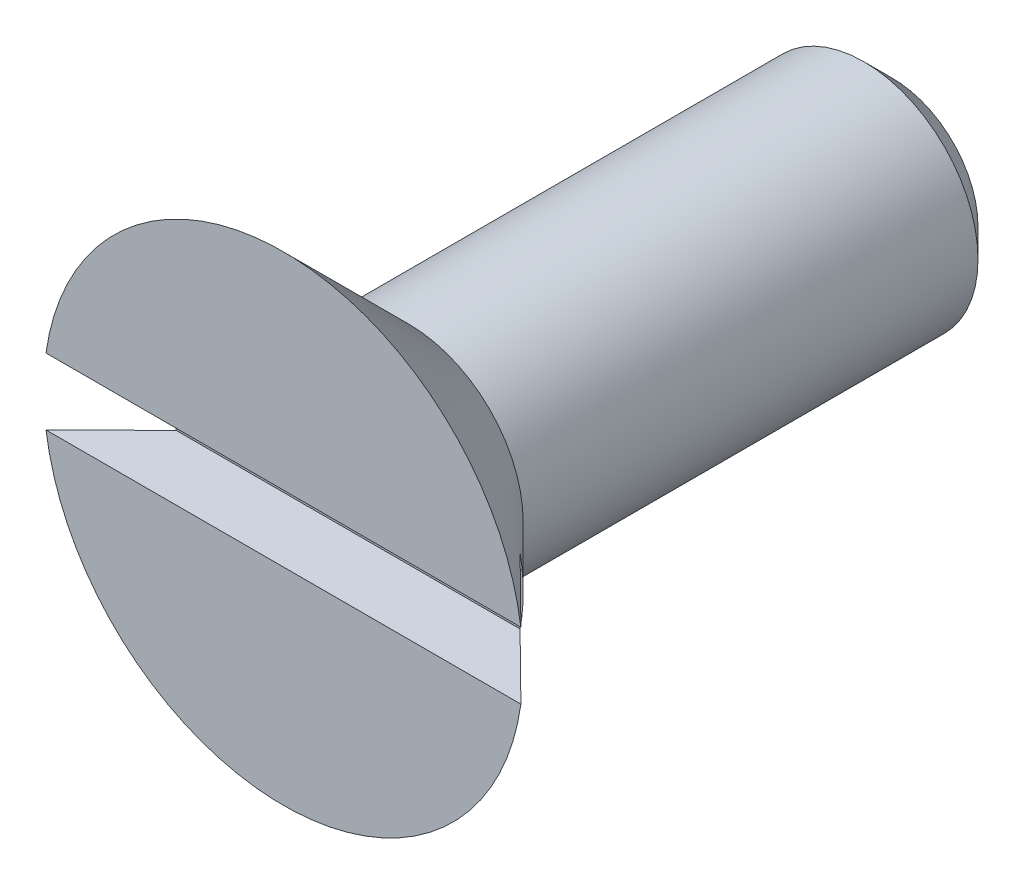
ISO-10303-21;
HEADER;
FILE_DESCRIPTION(('STEP AP214'),'2;1');
FILE_NAME('part.step','',(''),(''),'','','');
FILE_SCHEMA(('AUTOMOTIVE_DESIGN { 1 0 10303 214 1 1 1 1 }'));
ENDSEC;
DATA;
#1=APPLICATION_CONTEXT('core data for automotive mechanical design processes');
#2=APPLICATION_PROTOCOL_DEFINITION('international standard','automotive_design',2000,#1);
#3=PRODUCT_CONTEXT('',#1,'mechanical');
#4=PRODUCT('Part','Part','',(#3));
#5=PRODUCT_RELATED_PRODUCT_CATEGORY('part','',(#4));
#6=PRODUCT_DEFINITION_FORMATION('','',#4);
#7=PRODUCT_DEFINITION_CONTEXT('part definition',#1,'design');
#8=PRODUCT_DEFINITION('design','',#6,#7);
#9=PRODUCT_DEFINITION_SHAPE('','',#8);
#10=(LENGTH_UNIT() NAMED_UNIT(*) SI_UNIT(.MILLI.,.METRE.));
#11=(NAMED_UNIT(*) PLANE_ANGLE_UNIT() SI_UNIT($,.RADIAN.));
#12=(NAMED_UNIT(*) SI_UNIT($,.STERADIAN.) SOLID_ANGLE_UNIT());
#13=UNCERTAINTY_MEASURE_WITH_UNIT(LENGTH_MEASURE(1.E-05),#10,'distance_accuracy_value','');
#14=(GEOMETRIC_REPRESENTATION_CONTEXT(3) GLOBAL_UNCERTAINTY_ASSIGNED_CONTEXT((#13)) GLOBAL_UNIT_ASSIGNED_CONTEXT((#10,
#11,#12)) REPRESENTATION_CONTEXT('',''));
#15=CARTESIAN_POINT('',(0.,0.,0.));
#16=DIRECTION('',(0.,0.,1.));
#17=DIRECTION('',(1.,0.,0.));
#18=AXIS2_PLACEMENT_3D('',#15,#16,#17);
#19=CARTESIAN_POINT('',(0.,0.,1.7));
#20=DIRECTION('',(0.,0.,-1.));
#21=DIRECTION('',(-1.,0.,0.));
#22=AXIS2_PLACEMENT_3D('',#19,#20,#21);
#23=PLANE('',#22);
#24=CARTESIAN_POINT('',(0.,0.,1.7));
#25=DIRECTION('',(0.,0.,1.));
#26=DIRECTION('',(1.,0.,0.));
#27=AXIS2_PLACEMENT_3D('',#24,#25,#26);
#28=CIRCLE('',#27,3.15);
#29=CARTESIAN_POINT('',(-3.11947010724578,-0.4375,1.7));
#30=VERTEX_POINT('',#29);
#31=CARTESIAN_POINT('',(3.11947010724578,-0.4375,1.7));
#32=VERTEX_POINT('',#31);
#33=EDGE_CURVE('E104',#30,#32,#28,.T.);
#34=ORIENTED_EDGE('',*,*,#33,.T.);
#35=DIRECTION('',(1.,0.,0.));
#36=VECTOR('',#35,1.);
#37=CARTESIAN_POINT('',(-3.15,-0.4375,1.7));
#38=LINE('',#37,#36);
#39=EDGE_CURVE('E98',#30,#32,#38,.T.);
#40=ORIENTED_EDGE('',*,*,#39,.F.);
#41=EDGE_LOOP('',(#34,#40));
#42=FACE_BOUND('',#41,.T.);
#43=ADVANCED_FACE('F41',(#42),#23,.F.);
#44=CARTESIAN_POINT('',(3.11947010724578,0.4375,1.7));
#45=VERTEX_POINT('',#44);
#46=CARTESIAN_POINT('',(-3.11947010724578,0.4375,1.7));
#47=VERTEX_POINT('',#46);
#48=EDGE_CURVE('E97',#45,#47,#28,.T.);
#49=ORIENTED_EDGE('',*,*,#48,.T.);
#50=DIRECTION('',(-1.,0.,0.));
#51=VECTOR('',#50,1.);
#52=CARTESIAN_POINT('',(-3.15,0.4375,1.7));
#53=LINE('',#52,#51);
#54=EDGE_CURVE('E89',#45,#47,#53,.T.);
#55=ORIENTED_EDGE('',*,*,#54,.F.);
#56=EDGE_LOOP('',(#49,#55));
#57=FACE_BOUND('',#56,.T.);
#58=ADVANCED_FACE('F43',(#57),#23,.F.);
#59=CARTESIAN_POINT('',(0.,0.,0.0500000000000079));
#60=DIRECTION('',(0.,0.,1.));
#61=DIRECTION('',(1.,0.,0.));
#62=AXIS2_PLACEMENT_3D('',#59,#60,#61);
#63=CONICAL_SURFACE('',#62,1.5,0.785398163397451);
#64=ORIENTED_EDGE('',*,*,#33,.F.);
#65=CARTESIAN_POINT('',(-6.95069435097477,-0.4375,5.51444959854491));
#66=CARTESIAN_POINT('',(-6.71545377725601,-0.4375,5.27967721431496));
#67=CARTESIAN_POINT('',(-6.48019303350266,-0.4375,5.04492502441663));
#68=CARTESIAN_POINT('',(-6.00960192345305,-0.4375,4.57548243964187));
#69=CARTESIAN_POINT('',(-5.77427155604116,-0.4375,4.34079204588382));
#70=CARTESIAN_POINT('',(-5.30343158176121,-0.4375,3.87141438717137));
#71=CARTESIAN_POINT('',(-5.06792194077094,-0.4375,3.63672715644325));
#72=CARTESIAN_POINT('',(-4.59677017117157,-0.4375,3.16749350357989));
#73=CARTESIAN_POINT('',(-4.3611280448257,-0.4375,2.93294707917283));
#74=CARTESIAN_POINT('',(-3.87890631331682,-0.4375,2.45341460844365));
#75=CARTESIAN_POINT('',(-3.63231655090313,-0.4375,2.20843877608446));
#76=CARTESIAN_POINT('',(-3.13871112808016,-0.4375,1.71889165526523));
#77=CARTESIAN_POINT('',(-2.89169544725845,-0.4375,1.47432038736061));
#78=CARTESIAN_POINT('',(-2.52054668169718,-0.4375,1.10815678841121));
#79=CARTESIAN_POINT('',(-2.3967412827444,-0.4375,0.986232561251597));
#80=CARTESIAN_POINT('',(-2.14877789483762,-0.4375,0.74273812276414));
#81=CARTESIAN_POINT('',(-2.02461989882203,-0.4375,0.621167918626616));
#82=CARTESIAN_POINT('',(-1.77574261990939,-0.4375,0.378624419174153));
#83=CARTESIAN_POINT('',(-1.65102338979819,-0.4375,0.257651069877583));
#84=CARTESIAN_POINT('',(-1.46312840439675,-0.4375,0.0770435419685614));
#85=CARTESIAN_POINT('',(-1.40036175145822,-0.4375,0.0169840897073071));
#86=CARTESIAN_POINT('',(-1.27442762204848,-0.4375,-0.10271274659936));
#87=CARTESIAN_POINT('',(-1.21126015041921,-0.4375,-0.162350135725008));
#88=CARTESIAN_POINT('',(-1.11382173052775,-0.4375,-0.25339613639642));
#89=CARTESIAN_POINT('',(-1.07976946155462,-0.4375,-0.285038611518478));
#90=CARTESIAN_POINT('',(-1.01143604619376,-0.4375,-0.348076858100941));
#91=CARTESIAN_POINT('',(-0.977154895825766,-0.4375,-0.3794726252503));
#92=CARTESIAN_POINT('',(-0.908445877673763,-0.4375,-0.441798127970912));
#93=CARTESIAN_POINT('',(-0.874019325470927,-0.4375,-0.472729308933459));
#94=CARTESIAN_POINT('',(-0.804767226320551,-0.4375,-0.534138554654185));
#95=CARTESIAN_POINT('',(-0.7699416938768,-0.4375,-0.564616635791555));
#96=CARTESIAN_POINT('',(-0.687524321535922,-0.4375,-0.635446109424893));
#97=CARTESIAN_POINT('',(-0.63970868674946,-0.4375,-0.675541043817061));
#98=CARTESIAN_POINT('',(-0.566556991446948,-0.4375,-0.73432913801779));
#99=CARTESIAN_POINT('',(-0.54182952959947,-0.4375,-0.753777222319424));
#100=CARTESIAN_POINT('',(-0.491822543056473,-0.4375,-0.791947470581388));
#101=CARTESIAN_POINT('',(-0.466543099302396,-0.4375,-0.810669739870932));
#102=CARTESIAN_POINT('',(-0.414775435391958,-0.4375,-0.847417533943371));
#103=CARTESIAN_POINT('',(-0.388273549584466,-0.4375,-0.865423985183118));
#104=CARTESIAN_POINT('',(-0.334192522338339,-0.4375,-0.899859213763832));
#105=CARTESIAN_POINT('',(-0.306611926297403,-0.4375,-0.916285749684858));
#106=CARTESIAN_POINT('',(-0.250452865815358,-0.4375,-0.946436009532494));
#107=CARTESIAN_POINT('',(-0.221892495276722,-0.4375,-0.960192701204188));
#108=CARTESIAN_POINT('',(-0.163218417249906,-0.4375,-0.983807638318881));
#109=CARTESIAN_POINT('',(-0.133110728635988,-0.4375,-0.993679862316532));
#110=CARTESIAN_POINT('',(-0.0880223692180264,-0.4375,-1.00395141312084));
#111=CARTESIAN_POINT('',(-0.073551465305175,-0.4375,-1.00659400426285));
#112=CARTESIAN_POINT('',(-0.0444235926394925,-0.4375,-1.01048860754213));
#113=CARTESIAN_POINT('',(-0.0297666321560671,-0.4375,-1.0117406812645));
#114=CARTESIAN_POINT('',(0.0142250952761395,-0.4375,-1.01323688027924));
#115=CARTESIAN_POINT('',(0.0436649939441677,-0.4375,-1.01124128469903));
#116=CARTESIAN_POINT('',(0.101292142840405,-0.4375,-1.0018327116412));
#117=CARTESIAN_POINT('',(0.129488837077696,-0.4375,-0.994472979526124));
#118=CARTESIAN_POINT('',(0.170809309856394,-0.4375,-0.980519211556384));
#119=CARTESIAN_POINT('',(0.184454897966584,-0.4375,-0.975364865735926));
#120=CARTESIAN_POINT('',(0.211412528671322,-0.4375,-0.96425186784909));
#121=CARTESIAN_POINT('',(0.224724643745628,-0.4375,-0.958293392389047));
#122=CARTESIAN_POINT('',(0.266777045448894,-0.4375,-0.938210779497741));
#123=CARTESIAN_POINT('',(0.294921432003761,-0.4375,-0.922845882651961));
#124=CARTESIAN_POINT('',(0.350046604409141,-0.4375,-0.89013582475984));
#125=CARTESIAN_POINT('',(0.377025762743036,-0.4375,-0.87278800997322));
#126=CARTESIAN_POINT('',(0.430201279890642,-0.4375,-0.83673288612168));
#127=CARTESIAN_POINT('',(0.456394298082687,-0.4375,-0.818020690833663));
#128=CARTESIAN_POINT('',(0.50812313076528,-0.4375,-0.77970481009805));
#129=CARTESIAN_POINT('',(0.533658785434775,-0.4375,-0.760100911001922));
#130=CARTESIAN_POINT('',(0.610057648748741,-0.4375,-0.699952314625999));
#131=CARTESIAN_POINT('',(0.660169188221462,-0.4375,-0.658457053720058));
#132=CARTESIAN_POINT('',(0.759095952529052,-0.4375,-0.574228201210139));
#133=CARTESIAN_POINT('',(0.807914210937513,-0.4375,-0.531498112455194));
#134=CARTESIAN_POINT('',(0.903777928724115,-0.4375,-0.4461297183887));
#135=CARTESIAN_POINT('',(0.950838989272428,-0.4375,-0.403508906492821));
#136=CARTESIAN_POINT('',(1.04448251759101,-0.4375,-0.317745372768809));
#137=CARTESIAN_POINT('',(1.09106497765321,-0.4375,-0.274602642559246));
#138=CARTESIAN_POINT('',(1.23032604080343,-0.4375,-0.144633863624959));
#139=CARTESIAN_POINT('',(1.32250810126808,-0.4375,-0.05727648186134));
#140=CARTESIAN_POINT('',(1.50626750098789,-0.4375,0.118289223323196));
#141=CARTESIAN_POINT('',(1.59784397500925,-0.4375,0.206498447368561));
#142=CARTESIAN_POINT('',(1.78054968777642,-0.4375,0.383368131795782));
#143=CARTESIAN_POINT('',(1.8716789522241,-0.4375,0.47202856563489));
#144=CARTESIAN_POINT('',(2.0527126028453,-0.4375,0.648726833335544));
#145=CARTESIAN_POINT('',(2.14261992922196,-0.4375,0.73676165898462));
#146=CARTESIAN_POINT('',(2.32224140147481,-0.4375,0.913030831048659));
#147=CARTESIAN_POINT('',(2.41195554439885,-0.4375,1.00126518047099));
#148=CARTESIAN_POINT('',(2.68081262073546,-0.4375,1.26610037012193));
#149=CARTESIAN_POINT('',(2.85974916511933,-0.4375,1.44291065018944));
#150=CARTESIAN_POINT('',(3.36306970387667,-0.4375,1.94108895648711));
#151=CARTESIAN_POINT('',(3.68711145552849,-0.4375,2.26280243883242));
#152=CARTESIAN_POINT('',(4.33482479338633,-0.4375,2.90671341989869));
#153=CARTESIAN_POINT('',(4.65849630580628,-0.4375,3.22891099276393));
#154=CARTESIAN_POINT('',(5.31036659154146,-0.4375,3.87827901327936));
#155=CARTESIAN_POINT('',(5.63856193497032,-0.4375,4.20545290383715));
#156=CARTESIAN_POINT('',(6.29474601208318,-0.4375,4.85989136733905));
#157=CARTESIAN_POINT('',(6.6227347721014,-0.4375,5.18715591387629));
#158=CARTESIAN_POINT('',(6.95069435097477,-0.4375,5.51444959854491));
#159=B_SPLINE_CURVE_WITH_KNOTS('',3,(#65,#66,#67,#68,#69,#70,#71,#72,#73,#74,#75,#76,#77,#78,
#79,#80,#81,#82,#83,#84,#85,#86,#87,#88,#89,#90,#91,#92,#93,#94,#95,#96,#97,#98,#99,#100,#101,
#102,#103,#104,#105,#106,#107,#108,#109,#110,#111,#112,#113,#114,#115,#116,#117,#118,#119,#120,
#121,#122,#123,#124,#125,#126,#127,#128,#129,#130,#131,#132,#133,#134,#135,#136,#137,#138,#139,
#140,#141,#142,#143,#144,#145,#146,#147,#148,#149,#150,#151,#152,#153,#154,#155,#156,#157,#158),
.UNSPECIFIED.,.F.,.F.,(4,2,2,2,2,2,2,2,2,2,2,2,2,2,2,2,2,2,2,2,2,2,2,2,2,2,2,2,2,2,2,2,2,2,2,2,
2,2,2,2,2,2,2,2,2,2,4),(0.,0.997048560654659,1.99411407159498,2.9915537582241,3.98897689423789,
5.03175047299187,6.07457549937006,6.59586149567601,7.11715800663534,7.63840647212515,
7.89902218841885,8.15963476241322,8.29908714979861,8.43854196861998,8.5773812160964,
8.71621543238273,8.90338051507032,8.99774881127713,9.09210336123648,9.18818823101548,
9.28440746521176,9.37935012372772,9.473947928805,9.5180182515728,9.56208662241713,
9.64996810467844,9.73698893848584,9.78072959357587,9.82446065774542,9.92051040347212,
10.0166902318302,10.1132332446856,10.2097995119603,10.4049299988875,10.5995527867628,
10.7900231132878,10.9804965026262,11.3614846523295,11.74293313361,12.1243594294601,
12.5018522839031,12.8793508666369,13.634016533687,15.0038781067776,16.3739768056718,
17.7642265085964,19.1542294238138),.UNSPECIFIED.);
#160=CARTESIAN_POINT('',(-2.25800658767861,-0.4375,0.85));
#161=VERTEX_POINT('',#160);
#162=EDGE_CURVE('E11',#30,#161,#159,.T.);
#163=ORIENTED_EDGE('',*,*,#162,.T.);
#164=CARTESIAN_POINT('',(0.,0.,0.85));
#165=DIRECTION('',(0.,0.,1.));
#166=DIRECTION('',(1.,0.,0.));
#167=AXIS2_PLACEMENT_3D('',#164,#165,#166);
#168=CIRCLE('',#167,2.3);
#169=CARTESIAN_POINT('',(-2.25800658767861,0.4375,0.85));
#170=VERTEX_POINT('',#169);
#171=EDGE_CURVE('E107',#170,#161,#168,.T.);
#172=ORIENTED_EDGE('',*,*,#171,.F.);
#173=CARTESIAN_POINT('',(6.95069435097477,0.4375,5.51444959854491));
#174=CARTESIAN_POINT('',(6.71545377725601,0.4375,5.27967721431496));
#175=CARTESIAN_POINT('',(6.48019303350266,0.4375,5.04492502441663));
#176=CARTESIAN_POINT('',(6.00960192345305,0.4375,4.57548243964187));
#177=CARTESIAN_POINT('',(5.77427155604116,0.4375,4.34079204588382));
#178=CARTESIAN_POINT('',(5.30343158176121,0.4375,3.87141438717137));
#179=CARTESIAN_POINT('',(5.06792194077094,0.4375,3.63672715644325));
#180=CARTESIAN_POINT('',(4.59677017117157,0.4375,3.16749350357989));
#181=CARTESIAN_POINT('',(4.3611280448257,0.4375,2.93294707917283));
#182=CARTESIAN_POINT('',(3.87890631331682,0.4375,2.45341460844365));
#183=CARTESIAN_POINT('',(3.63231655090313,0.4375,2.20843877608446));
#184=CARTESIAN_POINT('',(3.13871112808016,0.4375,1.71889165526523));
#185=CARTESIAN_POINT('',(2.89169544725845,0.4375,1.47432038736061));
#186=CARTESIAN_POINT('',(2.52054668169718,0.4375,1.10815678841121));
#187=CARTESIAN_POINT('',(2.3967412827444,0.4375,0.986232561251597));
#188=CARTESIAN_POINT('',(2.14877789483762,0.4375,0.74273812276414));
#189=CARTESIAN_POINT('',(2.02461989882203,0.4375,0.621167918626616));
#190=CARTESIAN_POINT('',(1.77574261990939,0.4375,0.378624419174153));
#191=CARTESIAN_POINT('',(1.65102338979819,0.4375,0.257651069877583));
#192=CARTESIAN_POINT('',(1.46312840439675,0.4375,0.0770435419685614));
#193=CARTESIAN_POINT('',(1.40036175145822,0.4375,0.0169840897073071));
#194=CARTESIAN_POINT('',(1.27442762204848,0.4375,-0.10271274659936));
#195=CARTESIAN_POINT('',(1.21126015041921,0.4375,-0.162350135725008));
#196=CARTESIAN_POINT('',(1.11382173052775,0.4375,-0.25339613639642));
#197=CARTESIAN_POINT('',(1.07976946155462,0.4375,-0.285038611518478));
#198=CARTESIAN_POINT('',(1.01143604619376,0.4375,-0.348076858100941));
#199=CARTESIAN_POINT('',(0.977154895825766,0.4375,-0.3794726252503));
#200=CARTESIAN_POINT('',(0.908445877673763,0.4375,-0.441798127970912));
#201=CARTESIAN_POINT('',(0.874019325470927,0.4375,-0.472729308933459));
#202=CARTESIAN_POINT('',(0.804767226320551,0.4375,-0.534138554654185));
#203=CARTESIAN_POINT('',(0.7699416938768,0.4375,-0.564616635791555));
#204=CARTESIAN_POINT('',(0.687524321535922,0.4375,-0.635446109424893));
#205=CARTESIAN_POINT('',(0.63970868674946,0.4375,-0.675541043817061));
#206=CARTESIAN_POINT('',(0.566556991446948,0.4375,-0.73432913801779));
#207=CARTESIAN_POINT('',(0.54182952959947,0.4375,-0.753777222319424));
#208=CARTESIAN_POINT('',(0.491822543056473,0.4375,-0.791947470581388));
#209=CARTESIAN_POINT('',(0.466543099302396,0.4375,-0.810669739870932));
#210=CARTESIAN_POINT('',(0.414775435391958,0.4375,-0.847417533943371));
#211=CARTESIAN_POINT('',(0.388273549584466,0.4375,-0.865423985183118));
#212=CARTESIAN_POINT('',(0.334192522338339,0.4375,-0.899859213763832));
#213=CARTESIAN_POINT('',(0.306611926297403,0.4375,-0.916285749684858));
#214=CARTESIAN_POINT('',(0.250452865815358,0.4375,-0.946436009532494));
#215=CARTESIAN_POINT('',(0.221892495276722,0.4375,-0.960192701204188));
#216=CARTESIAN_POINT('',(0.163218417249906,0.4375,-0.983807638318881));
#217=CARTESIAN_POINT('',(0.133110728635988,0.4375,-0.993679862316532));
#218=CARTESIAN_POINT('',(0.0880223692180264,0.4375,-1.00395141312084));
#219=CARTESIAN_POINT('',(0.073551465305175,0.4375,-1.00659400426285));
#220=CARTESIAN_POINT('',(0.0444235926394925,0.4375,-1.01048860754213));
#221=CARTESIAN_POINT('',(0.0297666321560671,0.4375,-1.0117406812645));
#222=CARTESIAN_POINT('',(-0.0142250952761395,0.4375,-1.01323688027924));
#223=CARTESIAN_POINT('',(-0.0436649939441677,0.4375,-1.01124128469903));
#224=CARTESIAN_POINT('',(-0.101292142840405,0.4375,-1.0018327116412));
#225=CARTESIAN_POINT('',(-0.129488837077696,0.4375,-0.994472979526124));
#226=CARTESIAN_POINT('',(-0.170809309856394,0.4375,-0.980519211556384));
#227=CARTESIAN_POINT('',(-0.184454897966584,0.4375,-0.975364865735926));
#228=CARTESIAN_POINT('',(-0.211412528671322,0.4375,-0.96425186784909));
#229=CARTESIAN_POINT('',(-0.224724643745628,0.4375,-0.958293392389047));
#230=CARTESIAN_POINT('',(-0.266777045448894,0.4375,-0.938210779497741));
#231=CARTESIAN_POINT('',(-0.294921432003761,0.4375,-0.922845882651961));
#232=CARTESIAN_POINT('',(-0.350046604409141,0.4375,-0.89013582475984));
#233=CARTESIAN_POINT('',(-0.377025762743036,0.4375,-0.87278800997322));
#234=CARTESIAN_POINT('',(-0.430201279890642,0.4375,-0.83673288612168));
#235=CARTESIAN_POINT('',(-0.456394298082687,0.4375,-0.818020690833663));
#236=CARTESIAN_POINT('',(-0.50812313076528,0.4375,-0.77970481009805));
#237=CARTESIAN_POINT('',(-0.533658785434775,0.4375,-0.760100911001922));
#238=CARTESIAN_POINT('',(-0.610057648748741,0.4375,-0.699952314625999));
#239=CARTESIAN_POINT('',(-0.660169188221462,0.4375,-0.658457053720058));
#240=CARTESIAN_POINT('',(-0.759095952529052,0.4375,-0.574228201210139));
#241=CARTESIAN_POINT('',(-0.807914210937513,0.4375,-0.531498112455194));
#242=CARTESIAN_POINT('',(-0.903777928724115,0.4375,-0.4461297183887));
#243=CARTESIAN_POINT('',(-0.950838989272428,0.4375,-0.403508906492821));
#244=CARTESIAN_POINT('',(-1.04448251759101,0.4375,-0.317745372768809));
#245=CARTESIAN_POINT('',(-1.09106497765321,0.4375,-0.274602642559246));
#246=CARTESIAN_POINT('',(-1.23032604080343,0.4375,-0.144633863624959));
#247=CARTESIAN_POINT('',(-1.32250810126808,0.4375,-0.05727648186134));
#248=CARTESIAN_POINT('',(-1.50626750098789,0.4375,0.118289223323196));
#249=CARTESIAN_POINT('',(-1.59784397500925,0.4375,0.206498447368561));
#250=CARTESIAN_POINT('',(-1.78054968777642,0.4375,0.383368131795782));
#251=CARTESIAN_POINT('',(-1.8716789522241,0.4375,0.47202856563489));
#252=CARTESIAN_POINT('',(-2.0527126028453,0.4375,0.648726833335544));
#253=CARTESIAN_POINT('',(-2.14261992922196,0.4375,0.73676165898462));
#254=CARTESIAN_POINT('',(-2.32224140147481,0.4375,0.913030831048659));
#255=CARTESIAN_POINT('',(-2.41195554439885,0.4375,1.00126518047099));
#256=CARTESIAN_POINT('',(-2.68081262073546,0.4375,1.26610037012193));
#257=CARTESIAN_POINT('',(-2.85974916511933,0.4375,1.44291065018944));
#258=CARTESIAN_POINT('',(-3.36306970387667,0.4375,1.94108895648711));
#259=CARTESIAN_POINT('',(-3.68711145552849,0.4375,2.26280243883242));
#260=CARTESIAN_POINT('',(-4.33482479338633,0.4375,2.90671341989869));
#261=CARTESIAN_POINT('',(-4.65849630580628,0.4375,3.22891099276393));
#262=CARTESIAN_POINT('',(-5.31036659154146,0.4375,3.87827901327936));
#263=CARTESIAN_POINT('',(-5.63856193497032,0.4375,4.20545290383715));
#264=CARTESIAN_POINT('',(-6.29474601208318,0.4375,4.85989136733905));
#265=CARTESIAN_POINT('',(-6.6227347721014,0.4375,5.18715591387629));
#266=CARTESIAN_POINT('',(-6.95069435097477,0.4375,5.51444959854491));
#267=B_SPLINE_CURVE_WITH_KNOTS('',3,(#173,#174,#175,#176,#177,#178,#179,#180,#181,#182,#183,
#184,#185,#186,#187,#188,#189,#190,#191,#192,#193,#194,#195,#196,#197,#198,#199,#200,#201,#202,
#203,#204,#205,#206,#207,#208,#209,#210,#211,#212,#213,#214,#215,#216,#217,#218,#219,#220,#221,
#222,#223,#224,#225,#226,#227,#228,#229,#230,#231,#232,#233,#234,#235,#236,#237,#238,#239,#240,
#241,#242,#243,#244,#245,#246,#247,#248,#249,#250,#251,#252,#253,#254,#255,#256,#257,#258,#259,
#260,#261,#262,#263,#264,#265,#266),.UNSPECIFIED.,.F.,.F.,(4,2,2,2,2,2,2,2,2,2,2,2,2,2,2,2,2,2,
2,2,2,2,2,2,2,2,2,2,2,2,2,2,2,2,2,2,2,2,2,2,2,2,2,2,2,2,4),(0.,0.997048560654659,
1.99411407159498,2.9915537582241,3.98897689423789,5.03175047299187,6.07457549937006,
6.59586149567601,7.11715800663534,7.63840647212515,7.89902218841885,8.15963476241322,
8.29908714979861,8.43854196861998,8.5773812160964,8.71621543238273,8.90338051507032,
8.99774881127713,9.09210336123648,9.18818823101548,9.28440746521176,9.37935012372772,
9.473947928805,9.5180182515728,9.56208662241713,9.64996810467844,9.73698893848584,
9.78072959357587,9.82446065774542,9.92051040347212,10.0166902318302,10.1132332446856,
10.2097995119603,10.4049299988875,10.5995527867628,10.7900231132878,10.9804965026262,
11.3614846523295,11.74293313361,12.1243594294601,12.5018522839031,12.8793508666369,
13.634016533687,15.0038781067776,16.3739768056718,17.7642265085964,19.1542294238138),.UNSPECIFIED.);
#268=EDGE_CURVE('E55',#170,#47,#267,.T.);
#269=ORIENTED_EDGE('',*,*,#268,.T.);
#270=ORIENTED_EDGE('',*,*,#48,.F.);
#271=CARTESIAN_POINT('',(2.25800658767861,0.4375,0.85));
#272=VERTEX_POINT('',#271);
#273=EDGE_CURVE('E86',#45,#272,#267,.T.);
#274=ORIENTED_EDGE('',*,*,#273,.T.);
#275=CARTESIAN_POINT('',(2.25800658767861,-0.4375,0.85));
#276=VERTEX_POINT('',#275);
#277=EDGE_CURVE('E94',#276,#272,#168,.T.);
#278=ORIENTED_EDGE('',*,*,#277,.F.);
#279=EDGE_CURVE('E45',#276,#32,#159,.T.);
#280=ORIENTED_EDGE('',*,*,#279,.T.);
#281=EDGE_LOOP('',(#64,#163,#172,#269,#270,#274,#278,#280));
#282=FACE_BOUND('',#281,.T.);
#283=CARTESIAN_POINT('',(0.,0.,0.0500000000000079));
#284=DIRECTION('',(0.,0.,1.));
#285=DIRECTION('',(1.,0.,0.));
#286=AXIS2_PLACEMENT_3D('',#283,#284,#285);
#287=CIRCLE('',#286,1.5);
#288=CARTESIAN_POINT('',(1.5,0.,0.0500000000000079));
#289=VERTEX_POINT('',#288);
#290=EDGE_CURVE('E109',#289,#289,#287,.T.);
#291=ORIENTED_EDGE('',*,*,#290,.T.);
#292=EDGE_LOOP('',(#291));
#293=FACE_BOUND('',#292,.T.);
#294=ADVANCED_FACE('F101',(#282,#293),#63,.T.);
#295=CARTESIAN_POINT('',(0.,0.,1.7));
#296=DIRECTION('',(0.,0.,1.));
#297=DIRECTION('',(1.,0.,0.));
#298=AXIS2_PLACEMENT_3D('',#295,#296,#297);
#299=CYLINDRICAL_SURFACE('',#298,1.5);
#300=ORIENTED_EDGE('',*,*,#290,.F.);
#301=EDGE_LOOP('',(#300));
#302=FACE_BOUND('',#301,.T.);
#303=CARTESIAN_POINT('',(0.,0.,-5.925));
#304=DIRECTION('',(0.,0.,1.));
#305=DIRECTION('',(1.,0.,0.));
#306=AXIS2_PLACEMENT_3D('',#303,#304,#305);
#307=CIRCLE('',#306,1.5);
#308=CARTESIAN_POINT('',(1.5,0.,-5.925));
#309=VERTEX_POINT('',#308);
#310=EDGE_CURVE('E152',#309,#309,#307,.T.);
#311=ORIENTED_EDGE('',*,*,#310,.T.);
#312=EDGE_LOOP('',(#311));
#313=FACE_BOUND('',#312,.T.);
#314=ADVANCED_FACE('F132',(#302,#313),#299,.T.);
#315=CARTESIAN_POINT('',(0.,0.,-6.3));
#316=DIRECTION('',(0.,0.,1.));
#317=DIRECTION('',(1.,0.,0.));
#318=AXIS2_PLACEMENT_3D('',#315,#316,#317);
#319=CONICAL_SURFACE('',#318,1.125,0.785398163397448);
#320=ORIENTED_EDGE('',*,*,#310,.F.);
#321=EDGE_LOOP('',(#320));
#322=FACE_BOUND('',#321,.T.);
#323=CARTESIAN_POINT('',(0.,0.,-6.3));
#324=DIRECTION('',(0.,0.,1.));
#325=DIRECTION('',(1.,0.,0.));
#326=AXIS2_PLACEMENT_3D('',#323,#324,#325);
#327=CIRCLE('',#326,1.125);
#328=CARTESIAN_POINT('',(1.125,0.,-6.3));
#329=VERTEX_POINT('',#328);
#330=EDGE_CURVE('E149',#329,#329,#327,.T.);
#331=ORIENTED_EDGE('',*,*,#330,.T.);
#332=EDGE_LOOP('',(#331));
#333=FACE_BOUND('',#332,.T.);
#334=ADVANCED_FACE('F129',(#322,#333),#319,.T.);
#335=CARTESIAN_POINT('',(0.,1.125,-6.3));
#336=DIRECTION('',(0.,0.,1.));
#337=DIRECTION('',(1.,0.,0.));
#338=AXIS2_PLACEMENT_3D('',#335,#336,#337);
#339=PLANE('',#338);
#340=ORIENTED_EDGE('',*,*,#330,.F.);
#341=EDGE_LOOP('',(#340));
#342=FACE_BOUND('',#341,.T.);
#343=ADVANCED_FACE('F126',(#342),#339,.F.);
#344=CARTESIAN_POINT('',(-3.15,-0.4375,0.85));
#345=DIRECTION('',(0.,-1.,0.));
#346=DIRECTION('',(0.,0.,-1.));
#347=AXIS2_PLACEMENT_3D('',#344,#345,#346);
#348=PLANE('',#347);
#349=ORIENTED_EDGE('',*,*,#39,.T.);
#350=ORIENTED_EDGE('',*,*,#279,.F.);
#351=DIRECTION('',(1.,0.,0.));
#352=VECTOR('',#351,1.);
#353=CARTESIAN_POINT('',(-3.15,-0.4375,0.85));
#354=LINE('',#353,#352);
#355=EDGE_CURVE('E62',#161,#276,#354,.T.);
#356=ORIENTED_EDGE('',*,*,#355,.F.);
#357=ORIENTED_EDGE('',*,*,#162,.F.);
#358=EDGE_LOOP('',(#349,#350,#356,#357));
#359=FACE_BOUND('',#358,.T.);
#360=ADVANCED_FACE('F123',(#359),#348,.F.);
#361=CARTESIAN_POINT('',(-3.15,0.4375,0.85));
#362=DIRECTION('',(0.,1.,0.));
#363=DIRECTION('',(0.,0.,1.));
#364=AXIS2_PLACEMENT_3D('',#361,#362,#363);
#365=PLANE('',#364);
#366=ORIENTED_EDGE('',*,*,#54,.T.);
#367=ORIENTED_EDGE('',*,*,#268,.F.);
#368=DIRECTION('',(-1.,0.,0.));
#369=VECTOR('',#368,1.);
#370=CARTESIAN_POINT('',(-3.15,0.4375,0.85));
#371=LINE('',#370,#369);
#372=EDGE_CURVE('E90',#272,#170,#371,.T.);
#373=ORIENTED_EDGE('',*,*,#372,.F.);
#374=ORIENTED_EDGE('',*,*,#273,.F.);
#375=EDGE_LOOP('',(#366,#367,#373,#374));
#376=FACE_BOUND('',#375,.T.);
#377=ADVANCED_FACE('F88',(#376),#365,.F.);
#378=CARTESIAN_POINT('',(0.,0.,0.85));
#379=DIRECTION('',(0.,0.,1.));
#380=DIRECTION('',(1.,0.,0.));
#381=AXIS2_PLACEMENT_3D('',#378,#379,#380);
#382=PLANE('',#381);
#383=ORIENTED_EDGE('',*,*,#171,.T.);
#384=ORIENTED_EDGE('',*,*,#355,.T.);
#385=ORIENTED_EDGE('',*,*,#277,.T.);
#386=ORIENTED_EDGE('',*,*,#372,.T.);
#387=EDGE_LOOP('',(#383,#384,#385,#386));
#388=FACE_BOUND('',#387,.T.);
#389=ADVANCED_FACE('F122',(#388),#382,.T.);
#390=CLOSED_SHELL('',(#43,#58,#294,#314,#334,#343,#360,#377,#389));
#391=MANIFOLD_SOLID_BREP('B2',#390);
#392=ADVANCED_BREP_SHAPE_REPRESENTATION('',(#18,#391),#14);
#393=SHAPE_DEFINITION_REPRESENTATION(#9,#392);
ENDSEC;
END-ISO-10303-21;
